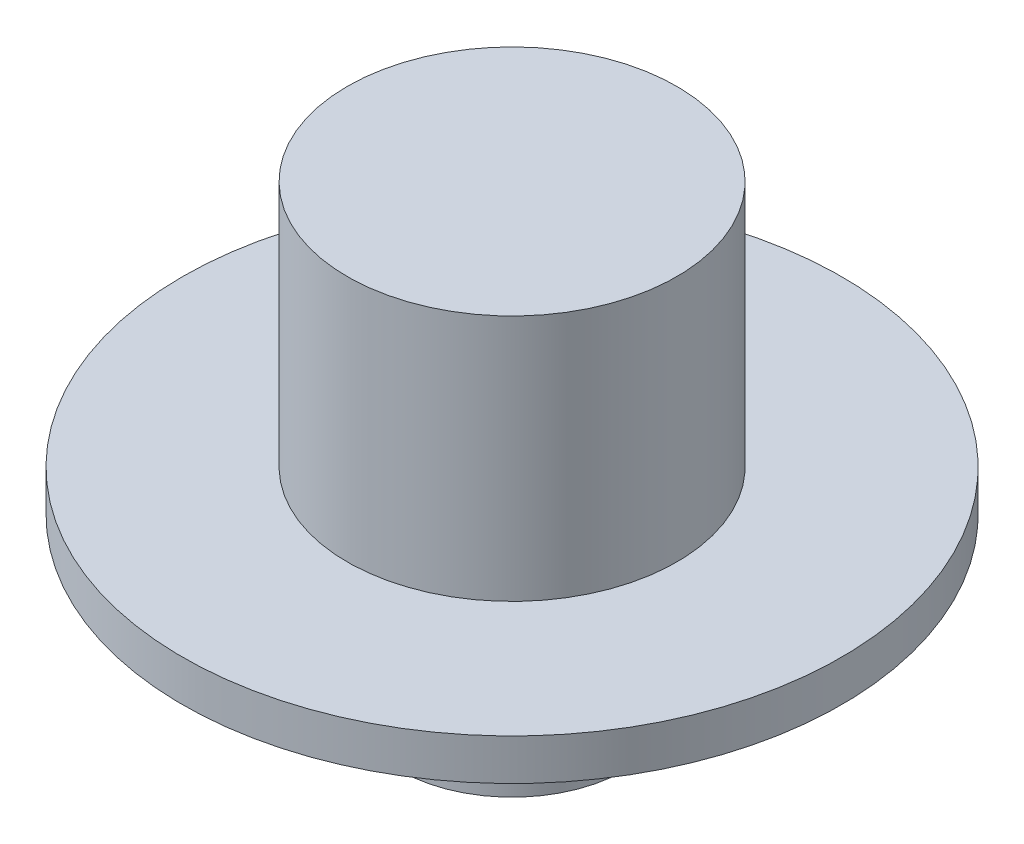
ISO-10303-21;
HEADER;
FILE_DESCRIPTION(('STEP AP214'),'2;1');
FILE_NAME('part.step','',(''),(''),'','','');
FILE_SCHEMA(('AUTOMOTIVE_DESIGN { 1 0 10303 214 1 1 1 1 }'));
ENDSEC;
DATA;
#1=APPLICATION_CONTEXT('core data for automotive mechanical design processes');
#2=APPLICATION_PROTOCOL_DEFINITION('international standard','automotive_design',2000,#1);
#3=PRODUCT_CONTEXT('',#1,'mechanical');
#4=PRODUCT('Part','Part','',(#3));
#5=PRODUCT_RELATED_PRODUCT_CATEGORY('part','',(#4));
#6=PRODUCT_DEFINITION_FORMATION('','',#4);
#7=PRODUCT_DEFINITION_CONTEXT('part definition',#1,'design');
#8=PRODUCT_DEFINITION('design','',#6,#7);
#9=PRODUCT_DEFINITION_SHAPE('','',#8);
#10=(LENGTH_UNIT() NAMED_UNIT(*) SI_UNIT(.MILLI.,.METRE.));
#11=(NAMED_UNIT(*) PLANE_ANGLE_UNIT() SI_UNIT($,.RADIAN.));
#12=(NAMED_UNIT(*) SI_UNIT($,.STERADIAN.) SOLID_ANGLE_UNIT());
#13=UNCERTAINTY_MEASURE_WITH_UNIT(LENGTH_MEASURE(1.E-05),#10,'distance_accuracy_value','');
#14=(GEOMETRIC_REPRESENTATION_CONTEXT(3) GLOBAL_UNCERTAINTY_ASSIGNED_CONTEXT((#13)) GLOBAL_UNIT_ASSIGNED_CONTEXT((#10,
#11,#12)) REPRESENTATION_CONTEXT('',''));
#15=CARTESIAN_POINT('',(0.,0.,0.));
#16=DIRECTION('',(0.,0.,1.));
#17=DIRECTION('',(1.,0.,0.));
#18=AXIS2_PLACEMENT_3D('',#15,#16,#17);
#19=CARTESIAN_POINT('',(0.,0.,0.));
#20=DIRECTION('',(0.,1.,0.));
#21=DIRECTION('',(-1.,0.,0.));
#22=AXIS2_PLACEMENT_3D('',#19,#20,#21);
#23=PLANE('',#22);
#24=CARTESIAN_POINT('',(0.,0.,0.));
#25=DIRECTION('',(0.,1.,0.));
#26=DIRECTION('',(-1.,0.,0.));
#27=AXIS2_PLACEMENT_3D('',#24,#25,#26);
#28=CIRCLE('',#27,1.375);
#29=CARTESIAN_POINT('',(-1.375,0.,0.));
#30=VERTEX_POINT('',#29);
#31=EDGE_CURVE('E10',#30,#30,#28,.T.);
#32=ORIENTED_EDGE('',*,*,#31,.F.);
#33=EDGE_LOOP('',(#32));
#34=FACE_BOUND('',#33,.T.);
#35=ADVANCED_FACE('F31',(#34),#23,.F.);
#36=CARTESIAN_POINT('',(0.,5.5,0.));
#37=DIRECTION('',(0.,1.,0.));
#38=DIRECTION('',(-1.,0.,0.));
#39=AXIS2_PLACEMENT_3D('',#36,#37,#38);
#40=CYLINDRICAL_SURFACE('',#39,1.375);
#41=CARTESIAN_POINT('',(0.,2.,0.));
#42=DIRECTION('',(0.,1.,0.));
#43=DIRECTION('',(-1.,0.,0.));
#44=AXIS2_PLACEMENT_3D('',#41,#42,#43);
#45=CIRCLE('',#44,1.375);
#46=CARTESIAN_POINT('',(-1.375,2.,0.));
#47=VERTEX_POINT('',#46);
#48=EDGE_CURVE('E37',#47,#47,#45,.T.);
#49=ORIENTED_EDGE('',*,*,#48,.F.);
#50=EDGE_LOOP('',(#49));
#51=FACE_BOUND('',#50,.T.);
#52=ORIENTED_EDGE('',*,*,#31,.T.);
#53=EDGE_LOOP('',(#52));
#54=FACE_BOUND('',#53,.T.);
#55=ADVANCED_FACE('F79',(#51,#54),#40,.T.);
#56=CARTESIAN_POINT('',(1.375,2.,0.));
#57=DIRECTION('',(0.,1.,0.));
#58=DIRECTION('',(-1.,0.,0.));
#59=AXIS2_PLACEMENT_3D('',#56,#57,#58);
#60=PLANE('',#59);
#61=CARTESIAN_POINT('',(0.,2.,0.));
#62=DIRECTION('',(0.,1.,0.));
#63=DIRECTION('',(-1.,0.,0.));
#64=AXIS2_PLACEMENT_3D('',#61,#62,#63);
#65=CIRCLE('',#64,4.);
#66=CARTESIAN_POINT('',(-4.,2.,0.));
#67=VERTEX_POINT('',#66);
#68=EDGE_CURVE('E41',#67,#67,#65,.T.);
#69=ORIENTED_EDGE('',*,*,#68,.F.);
#70=EDGE_LOOP('',(#69));
#71=FACE_BOUND('',#70,.T.);
#72=ORIENTED_EDGE('',*,*,#48,.T.);
#73=EDGE_LOOP('',(#72));
#74=FACE_BOUND('',#73,.T.);
#75=ADVANCED_FACE('F74',(#71,#74),#60,.F.);
#76=CARTESIAN_POINT('',(0.,5.5,0.));
#77=DIRECTION('',(0.,1.,0.));
#78=DIRECTION('',(-1.,0.,0.));
#79=AXIS2_PLACEMENT_3D('',#76,#77,#78);
#80=CYLINDRICAL_SURFACE('',#79,4.);
#81=CARTESIAN_POINT('',(0.,2.5,0.));
#82=DIRECTION('',(0.,1.,0.));
#83=DIRECTION('',(-1.,0.,0.));
#84=AXIS2_PLACEMENT_3D('',#81,#82,#83);
#85=CIRCLE('',#84,4.);
#86=CARTESIAN_POINT('',(-4.,2.5,0.));
#87=VERTEX_POINT('',#86);
#88=EDGE_CURVE('E45',#87,#87,#85,.T.);
#89=ORIENTED_EDGE('',*,*,#88,.F.);
#90=EDGE_LOOP('',(#89));
#91=FACE_BOUND('',#90,.T.);
#92=ORIENTED_EDGE('',*,*,#68,.T.);
#93=EDGE_LOOP('',(#92));
#94=FACE_BOUND('',#93,.T.);
#95=ADVANCED_FACE('F68',(#91,#94),#80,.T.);
#96=CARTESIAN_POINT('',(4.,2.5,0.));
#97=DIRECTION('',(0.,-1.,0.));
#98=DIRECTION('',(1.,0.,0.));
#99=AXIS2_PLACEMENT_3D('',#96,#97,#98);
#100=PLANE('',#99);
#101=CARTESIAN_POINT('',(0.,2.5,0.));
#102=DIRECTION('',(0.,1.,0.));
#103=DIRECTION('',(-1.,0.,0.));
#104=AXIS2_PLACEMENT_3D('',#101,#102,#103);
#105=CIRCLE('',#104,2.);
#106=CARTESIAN_POINT('',(-2.,2.5,0.));
#107=VERTEX_POINT('',#106);
#108=EDGE_CURVE('E50',#107,#107,#105,.T.);
#109=ORIENTED_EDGE('',*,*,#108,.F.);
#110=EDGE_LOOP('',(#109));
#111=FACE_BOUND('',#110,.T.);
#112=ORIENTED_EDGE('',*,*,#88,.T.);
#113=EDGE_LOOP('',(#112));
#114=FACE_BOUND('',#113,.T.);
#115=ADVANCED_FACE('F62',(#111,#114),#100,.F.);
#116=CARTESIAN_POINT('',(0.,5.5,0.));
#117=DIRECTION('',(0.,1.,0.));
#118=DIRECTION('',(-1.,0.,0.));
#119=AXIS2_PLACEMENT_3D('',#116,#117,#118);
#120=CYLINDRICAL_SURFACE('',#119,2.);
#121=CARTESIAN_POINT('',(0.,5.5,0.));
#122=DIRECTION('',(0.,1.,0.));
#123=DIRECTION('',(-1.,0.,0.));
#124=AXIS2_PLACEMENT_3D('',#121,#122,#123);
#125=CIRCLE('',#124,2.);
#126=CARTESIAN_POINT('',(-2.,5.5,0.));
#127=VERTEX_POINT('',#126);
#128=EDGE_CURVE('E53',#127,#127,#125,.T.);
#129=ORIENTED_EDGE('',*,*,#128,.F.);
#130=EDGE_LOOP('',(#129));
#131=FACE_BOUND('',#130,.T.);
#132=ORIENTED_EDGE('',*,*,#108,.T.);
#133=EDGE_LOOP('',(#132));
#134=FACE_BOUND('',#133,.T.);
#135=ADVANCED_FACE('F59',(#131,#134),#120,.T.);
#136=CARTESIAN_POINT('',(2.,5.5,0.));
#137=DIRECTION('',(0.,-1.,0.));
#138=DIRECTION('',(1.,0.,0.));
#139=AXIS2_PLACEMENT_3D('',#136,#137,#138);
#140=PLANE('',#139);
#141=ORIENTED_EDGE('',*,*,#128,.T.);
#142=EDGE_LOOP('',(#141));
#143=FACE_BOUND('',#142,.T.);
#144=ADVANCED_FACE('F57',(#143),#140,.F.);
#145=CLOSED_SHELL('',(#35,#55,#75,#95,#115,#135,#144));
#146=MANIFOLD_SOLID_BREP('B2',#145);
#147=ADVANCED_BREP_SHAPE_REPRESENTATION('',(#18,#146),#14);
#148=SHAPE_DEFINITION_REPRESENTATION(#9,#147);
ENDSEC;
END-ISO-10303-21;
